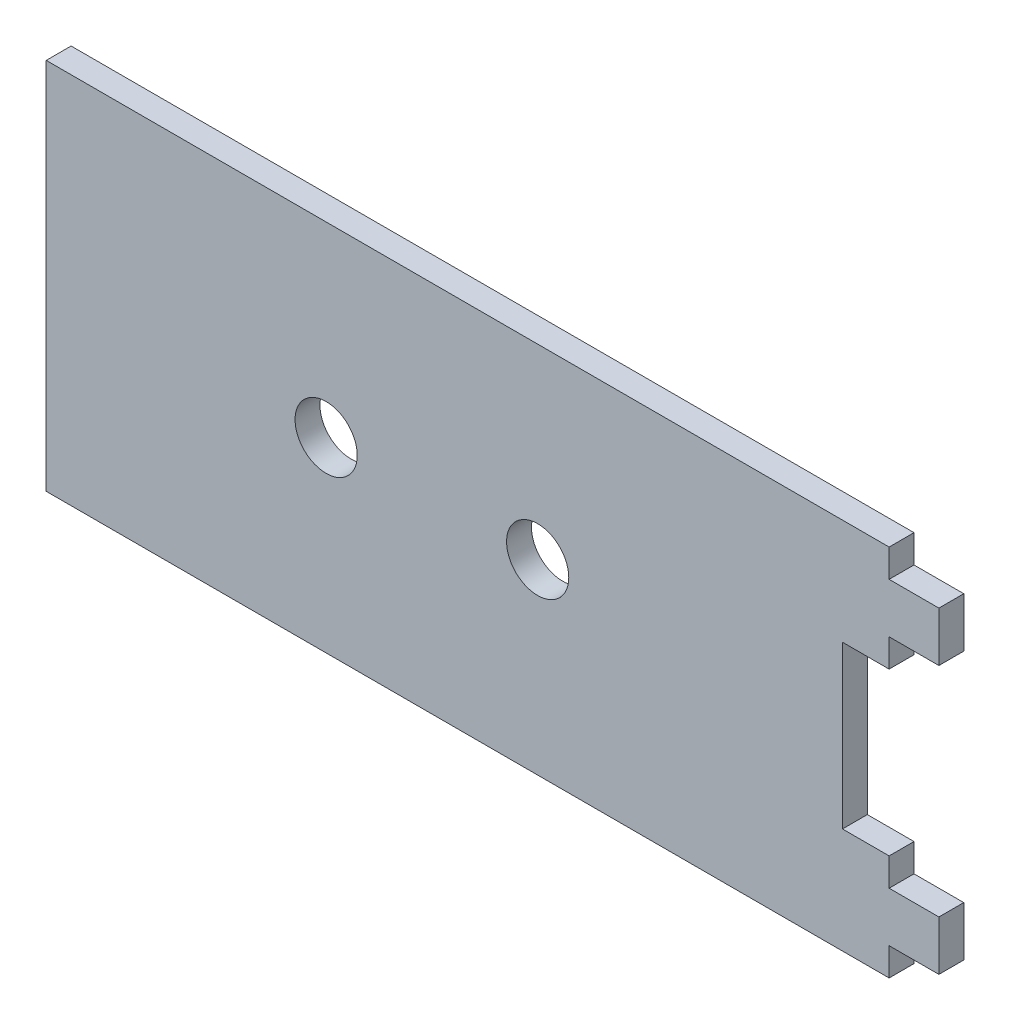
ISO-10303-21;
HEADER;
FILE_DESCRIPTION(('STEP AP214'),'2;1');
FILE_NAME('part.step','',(''),(''),'','','');
FILE_SCHEMA(('AUTOMOTIVE_DESIGN { 1 0 10303 214 1 1 1 1 }'));
ENDSEC;
DATA;
#1=APPLICATION_CONTEXT('core data for automotive mechanical design processes');
#2=APPLICATION_PROTOCOL_DEFINITION('international standard','automotive_design',2000,#1);
#3=PRODUCT_CONTEXT('',#1,'mechanical');
#4=PRODUCT('Part','Part','',(#3));
#5=PRODUCT_RELATED_PRODUCT_CATEGORY('part','',(#4));
#6=PRODUCT_DEFINITION_FORMATION('','',#4);
#7=PRODUCT_DEFINITION_CONTEXT('part definition',#1,'design');
#8=PRODUCT_DEFINITION('design','',#6,#7);
#9=PRODUCT_DEFINITION_SHAPE('','',#8);
#10=(LENGTH_UNIT() NAMED_UNIT(*) SI_UNIT(.MILLI.,.METRE.));
#11=(NAMED_UNIT(*) PLANE_ANGLE_UNIT() SI_UNIT($,.RADIAN.));
#12=(NAMED_UNIT(*) SI_UNIT($,.STERADIAN.) SOLID_ANGLE_UNIT());
#13=UNCERTAINTY_MEASURE_WITH_UNIT(LENGTH_MEASURE(1.E-05),#10,'distance_accuracy_value','');
#14=(GEOMETRIC_REPRESENTATION_CONTEXT(3) GLOBAL_UNCERTAINTY_ASSIGNED_CONTEXT((#13)) GLOBAL_UNIT_ASSIGNED_CONTEXT((#10,
#11,#12)) REPRESENTATION_CONTEXT('',''));
#15=CARTESIAN_POINT('',(0.,0.,0.));
#16=DIRECTION('',(0.,0.,1.));
#17=DIRECTION('',(1.,0.,0.));
#18=AXIS2_PLACEMENT_3D('',#15,#16,#17);
#19=CARTESIAN_POINT('',(0.,0.,4.));
#20=DIRECTION('',(0.,0.,-1.));
#21=DIRECTION('',(-1.,0.,0.));
#22=AXIS2_PLACEMENT_3D('',#19,#20,#21);
#23=PLANE('',#22);
#24=DIRECTION('',(-1.,0.,0.));
#25=VECTOR('',#24,1.);
#26=CARTESIAN_POINT('',(-79.,30.,4.));
#27=LINE('',#26,#25);
#28=CARTESIAN_POINT('',(56.5,30.,4.));
#29=VERTEX_POINT('',#28);
#30=CARTESIAN_POINT('',(-79.,30.,4.));
#31=VERTEX_POINT('',#30);
#32=EDGE_CURVE('E50',#29,#31,#27,.T.);
#33=ORIENTED_EDGE('',*,*,#32,.T.);
#34=DIRECTION('',(0.,-1.,0.));
#35=VECTOR('',#34,1.);
#36=CARTESIAN_POINT('',(-79.,-30.,4.));
#37=LINE('',#36,#35);
#38=CARTESIAN_POINT('',(-79.,-30.,4.));
#39=VERTEX_POINT('',#38);
#40=EDGE_CURVE('E118',#31,#39,#37,.T.);
#41=ORIENTED_EDGE('',*,*,#40,.T.);
#42=DIRECTION('',(1.,0.,0.));
#43=VECTOR('',#42,1.);
#44=CARTESIAN_POINT('',(-79.,-30.,4.));
#45=LINE('',#44,#43);
#46=CARTESIAN_POINT('',(56.5,-30.,4.));
#47=VERTEX_POINT('',#46);
#48=EDGE_CURVE('E250',#39,#47,#45,.T.);
#49=ORIENTED_EDGE('',*,*,#48,.T.);
#50=DIRECTION('',(0.,1.,0.));
#51=VECTOR('',#50,1.);
#52=CARTESIAN_POINT('',(56.5,-25.5,4.));
#53=LINE('',#52,#51);
#54=CARTESIAN_POINT('',(56.5,-25.5,4.));
#55=VERTEX_POINT('',#54);
#56=EDGE_CURVE('E270',#47,#55,#53,.T.);
#57=ORIENTED_EDGE('',*,*,#56,.T.);
#58=DIRECTION('',(1.,0.,0.));
#59=VECTOR('',#58,1.);
#60=CARTESIAN_POINT('',(64.5,-25.5,4.));
#61=LINE('',#60,#59);
#62=CARTESIAN_POINT('',(64.5,-25.5,4.));
#63=VERTEX_POINT('',#62);
#64=EDGE_CURVE('E267',#55,#63,#61,.T.);
#65=ORIENTED_EDGE('',*,*,#64,.T.);
#66=DIRECTION('',(0.,1.,0.));
#67=VECTOR('',#66,1.);
#68=CARTESIAN_POINT('',(64.5,-17.5,4.));
#69=LINE('',#68,#67);
#70=CARTESIAN_POINT('',(64.5,-17.5,4.));
#71=VERTEX_POINT('',#70);
#72=EDGE_CURVE('E269',#63,#71,#69,.T.);
#73=ORIENTED_EDGE('',*,*,#72,.T.);
#74=DIRECTION('',(-1.,0.,0.));
#75=VECTOR('',#74,1.);
#76=CARTESIAN_POINT('',(56.5,-17.5,4.));
#77=LINE('',#76,#75);
#78=CARTESIAN_POINT('',(56.5,-17.5,4.));
#79=VERTEX_POINT('',#78);
#80=EDGE_CURVE('E272',#71,#79,#77,.T.);
#81=ORIENTED_EDGE('',*,*,#80,.T.);
#82=DIRECTION('',(0.,1.,0.));
#83=VECTOR('',#82,1.);
#84=CARTESIAN_POINT('',(56.5,-13.,4.));
#85=LINE('',#84,#83);
#86=CARTESIAN_POINT('',(56.5,-13.,4.));
#87=VERTEX_POINT('',#86);
#88=EDGE_CURVE('E278',#79,#87,#85,.T.);
#89=ORIENTED_EDGE('',*,*,#88,.T.);
#90=DIRECTION('',(-1.,0.,0.));
#91=VECTOR('',#90,1.);
#92=CARTESIAN_POINT('',(49.,-13.,4.));
#93=LINE('',#92,#91);
#94=CARTESIAN_POINT('',(49.,-13.,4.));
#95=VERTEX_POINT('',#94);
#96=EDGE_CURVE('E280',#87,#95,#93,.T.);
#97=ORIENTED_EDGE('',*,*,#96,.T.);
#98=DIRECTION('',(0.,1.,0.));
#99=VECTOR('',#98,1.);
#100=CARTESIAN_POINT('',(49.,13.,4.));
#101=LINE('',#100,#99);
#102=CARTESIAN_POINT('',(49.,13.,4.));
#103=VERTEX_POINT('',#102);
#104=EDGE_CURVE('E282',#95,#103,#101,.T.);
#105=ORIENTED_EDGE('',*,*,#104,.T.);
#106=DIRECTION('',(1.,0.,0.));
#107=VECTOR('',#106,1.);
#108=CARTESIAN_POINT('',(56.5,13.,4.));
#109=LINE('',#108,#107);
#110=CARTESIAN_POINT('',(56.5,13.,4.));
#111=VERTEX_POINT('',#110);
#112=EDGE_CURVE('E284',#103,#111,#109,.T.);
#113=ORIENTED_EDGE('',*,*,#112,.T.);
#114=DIRECTION('',(0.,1.,0.));
#115=VECTOR('',#114,1.);
#116=CARTESIAN_POINT('',(56.5,17.5,4.));
#117=LINE('',#116,#115);
#118=CARTESIAN_POINT('',(56.5,17.5,4.));
#119=VERTEX_POINT('',#118);
#120=EDGE_CURVE('E286',#111,#119,#117,.T.);
#121=ORIENTED_EDGE('',*,*,#120,.T.);
#122=DIRECTION('',(1.,0.,0.));
#123=VECTOR('',#122,1.);
#124=CARTESIAN_POINT('',(64.5,17.5,4.));
#125=LINE('',#124,#123);
#126=CARTESIAN_POINT('',(64.5,17.5,4.));
#127=VERTEX_POINT('',#126);
#128=EDGE_CURVE('E162',#119,#127,#125,.T.);
#129=ORIENTED_EDGE('',*,*,#128,.T.);
#130=DIRECTION('',(0.,1.,0.));
#131=VECTOR('',#130,1.);
#132=CARTESIAN_POINT('',(64.5,25.5,4.));
#133=LINE('',#132,#131);
#134=CARTESIAN_POINT('',(64.5,25.5,4.));
#135=VERTEX_POINT('',#134);
#136=EDGE_CURVE('E156',#127,#135,#133,.T.);
#137=ORIENTED_EDGE('',*,*,#136,.T.);
#138=DIRECTION('',(-1.,0.,0.));
#139=VECTOR('',#138,1.);
#140=CARTESIAN_POINT('',(56.5,25.5,4.));
#141=LINE('',#140,#139);
#142=CARTESIAN_POINT('',(56.5,25.5,4.));
#143=VERTEX_POINT('',#142);
#144=EDGE_CURVE('E160',#135,#143,#141,.T.);
#145=ORIENTED_EDGE('',*,*,#144,.T.);
#146=DIRECTION('',(0.,1.,0.));
#147=VECTOR('',#146,1.);
#148=CARTESIAN_POINT('',(56.5,30.,4.));
#149=LINE('',#148,#147);
#150=EDGE_CURVE('E176',#143,#29,#149,.T.);
#151=ORIENTED_EDGE('',*,*,#150,.T.);
#152=EDGE_LOOP('',(#33,#41,#49,#57,#65,#73,#81,#89,#97,#105,#113,#121,#129,#137,#145,#151));
#153=FACE_BOUND('',#152,.T.);
#154=CARTESIAN_POINT('',(0.,0.,4.));
#155=DIRECTION('',(0.,0.,1.));
#156=DIRECTION('',(1.,0.,0.));
#157=AXIS2_PLACEMENT_3D('',#154,#155,#156);
#158=CIRCLE('',#157,5.);
#159=CARTESIAN_POINT('',(5.,0.,4.));
#160=VERTEX_POINT('',#159);
#161=EDGE_CURVE('E186',#160,#160,#158,.T.);
#162=ORIENTED_EDGE('',*,*,#161,.F.);
#163=EDGE_LOOP('',(#162));
#164=FACE_BOUND('',#163,.T.);
#165=CARTESIAN_POINT('',(-34.,0.,4.));
#166=DIRECTION('',(0.,0.,1.));
#167=DIRECTION('',(1.,0.,0.));
#168=AXIS2_PLACEMENT_3D('',#165,#166,#167);
#169=CIRCLE('',#168,5.);
#170=CARTESIAN_POINT('',(-29.,0.,4.));
#171=VERTEX_POINT('',#170);
#172=EDGE_CURVE('E497',#171,#171,#169,.T.);
#173=ORIENTED_EDGE('',*,*,#172,.F.);
#174=EDGE_LOOP('',(#173));
#175=FACE_BOUND('',#174,.T.);
#176=ADVANCED_FACE('F33',(#153,#164,#175),#23,.F.);
#177=CARTESIAN_POINT('',(0.,0.,0.));
#178=DIRECTION('',(0.,0.,-1.));
#179=DIRECTION('',(-1.,0.,0.));
#180=AXIS2_PLACEMENT_3D('',#177,#178,#179);
#181=PLANE('',#180);
#182=CARTESIAN_POINT('',(0.,0.,0.));
#183=DIRECTION('',(0.,0.,1.));
#184=DIRECTION('',(1.,0.,0.));
#185=AXIS2_PLACEMENT_3D('',#182,#183,#184);
#186=CIRCLE('',#185,5.);
#187=CARTESIAN_POINT('',(5.,0.,0.));
#188=VERTEX_POINT('',#187);
#189=EDGE_CURVE('E502',#188,#188,#186,.T.);
#190=ORIENTED_EDGE('',*,*,#189,.T.);
#191=EDGE_LOOP('',(#190));
#192=FACE_BOUND('',#191,.T.);
#193=DIRECTION('',(0.,-1.,0.));
#194=VECTOR('',#193,1.);
#195=CARTESIAN_POINT('',(-79.,-30.,0.));
#196=LINE('',#195,#194);
#197=CARTESIAN_POINT('',(-79.,30.,0.));
#198=VERTEX_POINT('',#197);
#199=CARTESIAN_POINT('',(-79.,-30.,0.));
#200=VERTEX_POINT('',#199);
#201=EDGE_CURVE('E182',#198,#200,#196,.T.);
#202=ORIENTED_EDGE('',*,*,#201,.F.);
#203=DIRECTION('',(-1.,0.,0.));
#204=VECTOR('',#203,1.);
#205=CARTESIAN_POINT('',(49.,30.,0.));
#206=LINE('',#205,#204);
#207=CARTESIAN_POINT('',(56.5,30.,0.));
#208=VERTEX_POINT('',#207);
#209=EDGE_CURVE('E211',#208,#198,#206,.T.);
#210=ORIENTED_EDGE('',*,*,#209,.F.);
#211=DIRECTION('',(0.,1.,0.));
#212=VECTOR('',#211,1.);
#213=CARTESIAN_POINT('',(56.5,30.,0.));
#214=LINE('',#213,#212);
#215=CARTESIAN_POINT('',(56.5,25.5,0.));
#216=VERTEX_POINT('',#215);
#217=EDGE_CURVE('E111',#216,#208,#214,.T.);
#218=ORIENTED_EDGE('',*,*,#217,.F.);
#219=DIRECTION('',(-1.,0.,0.));
#220=VECTOR('',#219,1.);
#221=CARTESIAN_POINT('',(56.5,25.5,0.));
#222=LINE('',#221,#220);
#223=CARTESIAN_POINT('',(64.5,25.5,0.));
#224=VERTEX_POINT('',#223);
#225=EDGE_CURVE('E104',#224,#216,#222,.T.);
#226=ORIENTED_EDGE('',*,*,#225,.F.);
#227=DIRECTION('',(0.,1.,0.));
#228=VECTOR('',#227,1.);
#229=CARTESIAN_POINT('',(64.5,25.5,0.));
#230=LINE('',#229,#228);
#231=CARTESIAN_POINT('',(64.5,17.5,0.));
#232=VERTEX_POINT('',#231);
#233=EDGE_CURVE('E170',#232,#224,#230,.T.);
#234=ORIENTED_EDGE('',*,*,#233,.F.);
#235=DIRECTION('',(1.,0.,0.));
#236=VECTOR('',#235,1.);
#237=CARTESIAN_POINT('',(64.5,17.5,0.));
#238=LINE('',#237,#236);
#239=CARTESIAN_POINT('',(56.5,17.5,0.));
#240=VERTEX_POINT('',#239);
#241=EDGE_CURVE('E206',#240,#232,#238,.T.);
#242=ORIENTED_EDGE('',*,*,#241,.F.);
#243=DIRECTION('',(0.,1.,0.));
#244=VECTOR('',#243,1.);
#245=CARTESIAN_POINT('',(56.5,17.5,0.));
#246=LINE('',#245,#244);
#247=CARTESIAN_POINT('',(56.5,13.,0.));
#248=VERTEX_POINT('',#247);
#249=EDGE_CURVE('E204',#248,#240,#246,.T.);
#250=ORIENTED_EDGE('',*,*,#249,.F.);
#251=DIRECTION('',(1.,0.,0.));
#252=VECTOR('',#251,1.);
#253=CARTESIAN_POINT('',(56.5,13.,0.));
#254=LINE('',#253,#252);
#255=CARTESIAN_POINT('',(49.,13.,0.));
#256=VERTEX_POINT('',#255);
#257=EDGE_CURVE('E202',#256,#248,#254,.T.);
#258=ORIENTED_EDGE('',*,*,#257,.F.);
#259=DIRECTION('',(0.,1.,0.));
#260=VECTOR('',#259,1.);
#261=CARTESIAN_POINT('',(49.,13.,0.));
#262=LINE('',#261,#260);
#263=CARTESIAN_POINT('',(49.,-13.,0.));
#264=VERTEX_POINT('',#263);
#265=EDGE_CURVE('E200',#264,#256,#262,.T.);
#266=ORIENTED_EDGE('',*,*,#265,.F.);
#267=DIRECTION('',(-1.,0.,0.));
#268=VECTOR('',#267,1.);
#269=CARTESIAN_POINT('',(49.,-13.,0.));
#270=LINE('',#269,#268);
#271=CARTESIAN_POINT('',(56.5,-13.,0.));
#272=VERTEX_POINT('',#271);
#273=EDGE_CURVE('E198',#272,#264,#270,.T.);
#274=ORIENTED_EDGE('',*,*,#273,.F.);
#275=DIRECTION('',(0.,1.,0.));
#276=VECTOR('',#275,1.);
#277=CARTESIAN_POINT('',(56.5,-13.,0.));
#278=LINE('',#277,#276);
#279=CARTESIAN_POINT('',(56.5,-17.5,0.));
#280=VERTEX_POINT('',#279);
#281=EDGE_CURVE('E196',#280,#272,#278,.T.);
#282=ORIENTED_EDGE('',*,*,#281,.F.);
#283=DIRECTION('',(-1.,0.,0.));
#284=VECTOR('',#283,1.);
#285=CARTESIAN_POINT('',(56.5,-17.5,0.));
#286=LINE('',#285,#284);
#287=CARTESIAN_POINT('',(64.5,-17.5,0.));
#288=VERTEX_POINT('',#287);
#289=EDGE_CURVE('E194',#288,#280,#286,.T.);
#290=ORIENTED_EDGE('',*,*,#289,.F.);
#291=DIRECTION('',(0.,1.,0.));
#292=VECTOR('',#291,1.);
#293=CARTESIAN_POINT('',(64.5,-17.5,0.));
#294=LINE('',#293,#292);
#295=CARTESIAN_POINT('',(64.5,-25.5,0.));
#296=VERTEX_POINT('',#295);
#297=EDGE_CURVE('E192',#296,#288,#294,.T.);
#298=ORIENTED_EDGE('',*,*,#297,.F.);
#299=DIRECTION('',(1.,0.,0.));
#300=VECTOR('',#299,1.);
#301=CARTESIAN_POINT('',(64.5,-25.5,0.));
#302=LINE('',#301,#300);
#303=CARTESIAN_POINT('',(56.5,-25.5,0.));
#304=VERTEX_POINT('',#303);
#305=EDGE_CURVE('E190',#304,#296,#302,.T.);
#306=ORIENTED_EDGE('',*,*,#305,.F.);
#307=DIRECTION('',(0.,1.,0.));
#308=VECTOR('',#307,1.);
#309=CARTESIAN_POINT('',(56.5,-25.5,0.));
#310=LINE('',#309,#308);
#311=CARTESIAN_POINT('',(56.5,-30.,0.));
#312=VERTEX_POINT('',#311);
#313=EDGE_CURVE('E188',#312,#304,#310,.T.);
#314=ORIENTED_EDGE('',*,*,#313,.F.);
#315=DIRECTION('',(1.,0.,0.));
#316=VECTOR('',#315,1.);
#317=CARTESIAN_POINT('',(56.5,-30.,0.));
#318=LINE('',#317,#316);
#319=EDGE_CURVE('E185',#200,#312,#318,.T.);
#320=ORIENTED_EDGE('',*,*,#319,.F.);
#321=EDGE_LOOP('',(#202,#210,#218,#226,#234,#242,#250,#258,#266,#274,#282,#290,#298,#306,#314,#320));
#322=FACE_BOUND('',#321,.T.);
#323=CARTESIAN_POINT('',(-34.,0.,0.));
#324=DIRECTION('',(0.,0.,1.));
#325=DIRECTION('',(1.,0.,0.));
#326=AXIS2_PLACEMENT_3D('',#323,#324,#325);
#327=CIRCLE('',#326,5.);
#328=CARTESIAN_POINT('',(-29.,0.,0.));
#329=VERTEX_POINT('',#328);
#330=EDGE_CURVE('E500',#329,#329,#327,.T.);
#331=ORIENTED_EDGE('',*,*,#330,.T.);
#332=EDGE_LOOP('',(#331));
#333=FACE_BOUND('',#332,.T.);
#334=ADVANCED_FACE('F254',(#192,#322,#333),#181,.T.);
#335=CARTESIAN_POINT('',(-79.,-30.,4.));
#336=DIRECTION('',(1.,0.,0.));
#337=DIRECTION('',(0.,0.,-1.));
#338=AXIS2_PLACEMENT_3D('',#335,#336,#337);
#339=PLANE('',#338);
#340=ORIENTED_EDGE('',*,*,#201,.T.);
#341=DIRECTION('',(0.,0.,-1.));
#342=VECTOR('',#341,1.);
#343=CARTESIAN_POINT('',(-79.,-30.,4.));
#344=LINE('',#343,#342);
#345=EDGE_CURVE('E42',#39,#200,#344,.T.);
#346=ORIENTED_EDGE('',*,*,#345,.F.);
#347=ORIENTED_EDGE('',*,*,#40,.F.);
#348=DIRECTION('',(0.,0.,-1.));
#349=VECTOR('',#348,1.);
#350=CARTESIAN_POINT('',(-79.,30.,4.));
#351=LINE('',#350,#349);
#352=EDGE_CURVE('E11',#31,#198,#351,.T.);
#353=ORIENTED_EDGE('',*,*,#352,.T.);
#354=EDGE_LOOP('',(#340,#346,#347,#353));
#355=FACE_BOUND('',#354,.T.);
#356=ADVANCED_FACE('F35',(#355),#339,.F.);
#357=CARTESIAN_POINT('',(56.5,-30.,4.));
#358=DIRECTION('',(0.,1.,0.));
#359=DIRECTION('',(0.,0.,1.));
#360=AXIS2_PLACEMENT_3D('',#357,#358,#359);
#361=PLANE('',#360);
#362=ORIENTED_EDGE('',*,*,#319,.T.);
#363=DIRECTION('',(0.,0.,-1.));
#364=VECTOR('',#363,1.);
#365=CARTESIAN_POINT('',(56.5,-30.,4.));
#366=LINE('',#365,#364);
#367=EDGE_CURVE('E243',#47,#312,#366,.T.);
#368=ORIENTED_EDGE('',*,*,#367,.F.);
#369=ORIENTED_EDGE('',*,*,#48,.F.);
#370=ORIENTED_EDGE('',*,*,#345,.T.);
#371=EDGE_LOOP('',(#362,#368,#369,#370));
#372=FACE_BOUND('',#371,.T.);
#373=ADVANCED_FACE('F248',(#372),#361,.F.);
#374=CARTESIAN_POINT('',(56.5,-25.5,4.));
#375=DIRECTION('',(-1.,0.,0.));
#376=DIRECTION('',(0.,0.,1.));
#377=AXIS2_PLACEMENT_3D('',#374,#375,#376);
#378=PLANE('',#377);
#379=ORIENTED_EDGE('',*,*,#313,.T.);
#380=DIRECTION('',(0.,0.,-1.));
#381=VECTOR('',#380,1.);
#382=CARTESIAN_POINT('',(56.5,-25.5,4.));
#383=LINE('',#382,#381);
#384=EDGE_CURVE('E240',#55,#304,#383,.T.);
#385=ORIENTED_EDGE('',*,*,#384,.F.);
#386=ORIENTED_EDGE('',*,*,#56,.F.);
#387=ORIENTED_EDGE('',*,*,#367,.T.);
#388=EDGE_LOOP('',(#379,#385,#386,#387));
#389=FACE_BOUND('',#388,.T.);
#390=ADVANCED_FACE('F261',(#389),#378,.F.);
#391=CARTESIAN_POINT('',(64.5,-25.5,4.));
#392=DIRECTION('',(0.,1.,0.));
#393=DIRECTION('',(0.,0.,1.));
#394=AXIS2_PLACEMENT_3D('',#391,#392,#393);
#395=PLANE('',#394);
#396=ORIENTED_EDGE('',*,*,#305,.T.);
#397=DIRECTION('',(0.,0.,-1.));
#398=VECTOR('',#397,1.);
#399=CARTESIAN_POINT('',(64.5,-25.5,4.));
#400=LINE('',#399,#398);
#401=EDGE_CURVE('E237',#63,#296,#400,.T.);
#402=ORIENTED_EDGE('',*,*,#401,.F.);
#403=ORIENTED_EDGE('',*,*,#64,.F.);
#404=ORIENTED_EDGE('',*,*,#384,.T.);
#405=EDGE_LOOP('',(#396,#402,#403,#404));
#406=FACE_BOUND('',#405,.T.);
#407=ADVANCED_FACE('F265',(#406),#395,.F.);
#408=CARTESIAN_POINT('',(64.5,-17.5,4.));
#409=DIRECTION('',(-1.,0.,0.));
#410=DIRECTION('',(0.,0.,1.));
#411=AXIS2_PLACEMENT_3D('',#408,#409,#410);
#412=PLANE('',#411);
#413=ORIENTED_EDGE('',*,*,#297,.T.);
#414=DIRECTION('',(0.,0.,-1.));
#415=VECTOR('',#414,1.);
#416=CARTESIAN_POINT('',(64.5,-17.5,4.));
#417=LINE('',#416,#415);
#418=EDGE_CURVE('E234',#71,#288,#417,.T.);
#419=ORIENTED_EDGE('',*,*,#418,.F.);
#420=ORIENTED_EDGE('',*,*,#72,.F.);
#421=ORIENTED_EDGE('',*,*,#401,.T.);
#422=EDGE_LOOP('',(#413,#419,#420,#421));
#423=FACE_BOUND('',#422,.T.);
#424=ADVANCED_FACE('F322',(#423),#412,.F.);
#425=CARTESIAN_POINT('',(56.5,-17.5,4.));
#426=DIRECTION('',(0.,-1.,0.));
#427=DIRECTION('',(0.,0.,-1.));
#428=AXIS2_PLACEMENT_3D('',#425,#426,#427);
#429=PLANE('',#428);
#430=ORIENTED_EDGE('',*,*,#289,.T.);
#431=DIRECTION('',(0.,0.,-1.));
#432=VECTOR('',#431,1.);
#433=CARTESIAN_POINT('',(56.5,-17.5,4.));
#434=LINE('',#433,#432);
#435=EDGE_CURVE('E231',#79,#280,#434,.T.);
#436=ORIENTED_EDGE('',*,*,#435,.F.);
#437=ORIENTED_EDGE('',*,*,#80,.F.);
#438=ORIENTED_EDGE('',*,*,#418,.T.);
#439=EDGE_LOOP('',(#430,#436,#437,#438));
#440=FACE_BOUND('',#439,.T.);
#441=ADVANCED_FACE('F319',(#440),#429,.F.);
#442=CARTESIAN_POINT('',(56.5,-13.,4.));
#443=DIRECTION('',(-1.,0.,0.));
#444=DIRECTION('',(0.,0.,1.));
#445=AXIS2_PLACEMENT_3D('',#442,#443,#444);
#446=PLANE('',#445);
#447=ORIENTED_EDGE('',*,*,#281,.T.);
#448=DIRECTION('',(0.,0.,-1.));
#449=VECTOR('',#448,1.);
#450=CARTESIAN_POINT('',(56.5,-13.,4.));
#451=LINE('',#450,#449);
#452=EDGE_CURVE('E228',#87,#272,#451,.T.);
#453=ORIENTED_EDGE('',*,*,#452,.F.);
#454=ORIENTED_EDGE('',*,*,#88,.F.);
#455=ORIENTED_EDGE('',*,*,#435,.T.);
#456=EDGE_LOOP('',(#447,#453,#454,#455));
#457=FACE_BOUND('',#456,.T.);
#458=ADVANCED_FACE('F314',(#457),#446,.F.);
#459=CARTESIAN_POINT('',(49.,-13.,4.));
#460=DIRECTION('',(0.,-1.,0.));
#461=DIRECTION('',(0.,0.,-1.));
#462=AXIS2_PLACEMENT_3D('',#459,#460,#461);
#463=PLANE('',#462);
#464=ORIENTED_EDGE('',*,*,#273,.T.);
#465=DIRECTION('',(0.,0.,-1.));
#466=VECTOR('',#465,1.);
#467=CARTESIAN_POINT('',(49.,-13.,4.));
#468=LINE('',#467,#466);
#469=EDGE_CURVE('E225',#95,#264,#468,.T.);
#470=ORIENTED_EDGE('',*,*,#469,.F.);
#471=ORIENTED_EDGE('',*,*,#96,.F.);
#472=ORIENTED_EDGE('',*,*,#452,.T.);
#473=EDGE_LOOP('',(#464,#470,#471,#472));
#474=FACE_BOUND('',#473,.T.);
#475=ADVANCED_FACE('F309',(#474),#463,.F.);
#476=CARTESIAN_POINT('',(49.,13.,4.));
#477=DIRECTION('',(-1.,0.,0.));
#478=DIRECTION('',(0.,0.,1.));
#479=AXIS2_PLACEMENT_3D('',#476,#477,#478);
#480=PLANE('',#479);
#481=ORIENTED_EDGE('',*,*,#265,.T.);
#482=DIRECTION('',(0.,0.,-1.));
#483=VECTOR('',#482,1.);
#484=CARTESIAN_POINT('',(49.,13.,4.));
#485=LINE('',#484,#483);
#486=EDGE_CURVE('E222',#103,#256,#485,.T.);
#487=ORIENTED_EDGE('',*,*,#486,.F.);
#488=ORIENTED_EDGE('',*,*,#104,.F.);
#489=ORIENTED_EDGE('',*,*,#469,.T.);
#490=EDGE_LOOP('',(#481,#487,#488,#489));
#491=FACE_BOUND('',#490,.T.);
#492=ADVANCED_FACE('F305',(#491),#480,.F.);
#493=CARTESIAN_POINT('',(56.5,13.,4.));
#494=DIRECTION('',(0.,1.,0.));
#495=DIRECTION('',(-1.,0.,0.));
#496=AXIS2_PLACEMENT_3D('',#493,#494,#495);
#497=PLANE('',#496);
#498=ORIENTED_EDGE('',*,*,#257,.T.);
#499=DIRECTION('',(0.,0.,-1.));
#500=VECTOR('',#499,1.);
#501=CARTESIAN_POINT('',(56.5,13.,4.));
#502=LINE('',#501,#500);
#503=EDGE_CURVE('E219',#111,#248,#502,.T.);
#504=ORIENTED_EDGE('',*,*,#503,.F.);
#505=ORIENTED_EDGE('',*,*,#112,.F.);
#506=ORIENTED_EDGE('',*,*,#486,.T.);
#507=EDGE_LOOP('',(#498,#504,#505,#506));
#508=FACE_BOUND('',#507,.T.);
#509=ADVANCED_FACE('F301',(#508),#497,.F.);
#510=CARTESIAN_POINT('',(56.5,17.5,4.));
#511=DIRECTION('',(-1.,0.,0.));
#512=DIRECTION('',(0.,0.,1.));
#513=AXIS2_PLACEMENT_3D('',#510,#511,#512);
#514=PLANE('',#513);
#515=ORIENTED_EDGE('',*,*,#249,.T.);
#516=DIRECTION('',(0.,0.,-1.));
#517=VECTOR('',#516,1.);
#518=CARTESIAN_POINT('',(56.5,17.5,4.));
#519=LINE('',#518,#517);
#520=EDGE_CURVE('E216',#119,#240,#519,.T.);
#521=ORIENTED_EDGE('',*,*,#520,.F.);
#522=ORIENTED_EDGE('',*,*,#120,.F.);
#523=ORIENTED_EDGE('',*,*,#503,.T.);
#524=EDGE_LOOP('',(#515,#521,#522,#523));
#525=FACE_BOUND('',#524,.T.);
#526=ADVANCED_FACE('F292',(#525),#514,.F.);
#527=CARTESIAN_POINT('',(64.5,17.5,4.));
#528=DIRECTION('',(0.,1.,0.));
#529=DIRECTION('',(0.,0.,1.));
#530=AXIS2_PLACEMENT_3D('',#527,#528,#529);
#531=PLANE('',#530);
#532=ORIENTED_EDGE('',*,*,#241,.T.);
#533=DIRECTION('',(0.,0.,-1.));
#534=VECTOR('',#533,1.);
#535=CARTESIAN_POINT('',(64.5,17.5,4.));
#536=LINE('',#535,#534);
#537=EDGE_CURVE('E171',#127,#232,#536,.T.);
#538=ORIENTED_EDGE('',*,*,#537,.F.);
#539=ORIENTED_EDGE('',*,*,#128,.F.);
#540=ORIENTED_EDGE('',*,*,#520,.T.);
#541=EDGE_LOOP('',(#532,#538,#539,#540));
#542=FACE_BOUND('',#541,.T.);
#543=ADVANCED_FACE('F296',(#542),#531,.F.);
#544=CARTESIAN_POINT('',(64.5,25.5,4.));
#545=DIRECTION('',(-1.,0.,0.));
#546=DIRECTION('',(0.,0.,1.));
#547=AXIS2_PLACEMENT_3D('',#544,#545,#546);
#548=PLANE('',#547);
#549=ORIENTED_EDGE('',*,*,#233,.T.);
#550=DIRECTION('',(0.,0.,-1.));
#551=VECTOR('',#550,1.);
#552=CARTESIAN_POINT('',(64.5,25.5,4.));
#553=LINE('',#552,#551);
#554=EDGE_CURVE('E167',#135,#224,#553,.T.);
#555=ORIENTED_EDGE('',*,*,#554,.F.);
#556=ORIENTED_EDGE('',*,*,#136,.F.);
#557=ORIENTED_EDGE('',*,*,#537,.T.);
#558=EDGE_LOOP('',(#549,#555,#556,#557));
#559=FACE_BOUND('',#558,.T.);
#560=ADVANCED_FACE('F168',(#559),#548,.F.);
#561=CARTESIAN_POINT('',(56.5,25.5,4.));
#562=DIRECTION('',(0.,-1.,0.));
#563=DIRECTION('',(0.,0.,-1.));
#564=AXIS2_PLACEMENT_3D('',#561,#562,#563);
#565=PLANE('',#564);
#566=ORIENTED_EDGE('',*,*,#225,.T.);
#567=DIRECTION('',(0.,0.,-1.));
#568=VECTOR('',#567,1.);
#569=CARTESIAN_POINT('',(56.5,25.5,4.));
#570=LINE('',#569,#568);
#571=EDGE_CURVE('E172',#143,#216,#570,.T.);
#572=ORIENTED_EDGE('',*,*,#571,.F.);
#573=ORIENTED_EDGE('',*,*,#144,.F.);
#574=ORIENTED_EDGE('',*,*,#554,.T.);
#575=EDGE_LOOP('',(#566,#572,#573,#574));
#576=FACE_BOUND('',#575,.T.);
#577=ADVANCED_FACE('F174',(#576),#565,.F.);
#578=CARTESIAN_POINT('',(56.5,30.,4.));
#579=DIRECTION('',(-1.,0.,0.));
#580=DIRECTION('',(0.,0.,1.));
#581=AXIS2_PLACEMENT_3D('',#578,#579,#580);
#582=PLANE('',#581);
#583=ORIENTED_EDGE('',*,*,#217,.T.);
#584=DIRECTION('',(0.,0.,-1.));
#585=VECTOR('',#584,1.);
#586=CARTESIAN_POINT('',(56.5,30.,4.));
#587=LINE('',#586,#585);
#588=EDGE_CURVE('E178',#29,#208,#587,.T.);
#589=ORIENTED_EDGE('',*,*,#588,.F.);
#590=ORIENTED_EDGE('',*,*,#150,.F.);
#591=ORIENTED_EDGE('',*,*,#571,.T.);
#592=EDGE_LOOP('',(#583,#589,#590,#591));
#593=FACE_BOUND('',#592,.T.);
#594=ADVANCED_FACE('F345',(#593),#582,.F.);
#595=CARTESIAN_POINT('',(49.,30.,4.));
#596=DIRECTION('',(0.,-1.,0.));
#597=DIRECTION('',(0.,0.,-1.));
#598=AXIS2_PLACEMENT_3D('',#595,#596,#597);
#599=PLANE('',#598);
#600=ORIENTED_EDGE('',*,*,#209,.T.);
#601=ORIENTED_EDGE('',*,*,#352,.F.);
#602=ORIENTED_EDGE('',*,*,#32,.F.);
#603=ORIENTED_EDGE('',*,*,#588,.T.);
#604=EDGE_LOOP('',(#600,#601,#602,#603));
#605=FACE_BOUND('',#604,.T.);
#606=ADVANCED_FACE('F342',(#605),#599,.F.);
#607=CARTESIAN_POINT('',(0.,0.,4.));
#608=DIRECTION('',(0.,0.,-1.));
#609=DIRECTION('',(-1.,0.,0.));
#610=AXIS2_PLACEMENT_3D('',#607,#608,#609);
#611=CYLINDRICAL_SURFACE('',#610,5.);
#612=ORIENTED_EDGE('',*,*,#161,.T.);
#613=EDGE_LOOP('',(#612));
#614=FACE_BOUND('',#613,.T.);
#615=ORIENTED_EDGE('',*,*,#189,.F.);
#616=EDGE_LOOP('',(#615));
#617=FACE_BOUND('',#616,.T.);
#618=ADVANCED_FACE('F339',(#614,#617),#611,.F.);
#619=CARTESIAN_POINT('',(-34.,0.,4.));
#620=DIRECTION('',(0.,0.,-1.));
#621=DIRECTION('',(-1.,0.,0.));
#622=AXIS2_PLACEMENT_3D('',#619,#620,#621);
#623=CYLINDRICAL_SURFACE('',#622,5.);
#624=ORIENTED_EDGE('',*,*,#172,.T.);
#625=EDGE_LOOP('',(#624));
#626=FACE_BOUND('',#625,.T.);
#627=ORIENTED_EDGE('',*,*,#330,.F.);
#628=EDGE_LOOP('',(#627));
#629=FACE_BOUND('',#628,.T.);
#630=ADVANCED_FACE('F409',(#626,#629),#623,.F.);
#631=CLOSED_SHELL('',(#176,#334,#356,#373,#390,#407,#424,#441,#458,#475,#492,#509,#526,#543,
#560,#577,#594,#606,#618,#630));
#632=MANIFOLD_SOLID_BREP('B2',#631);
#633=ADVANCED_BREP_SHAPE_REPRESENTATION('',(#18,#632),#14);
#634=SHAPE_DEFINITION_REPRESENTATION(#9,#633);
ENDSEC;
END-ISO-10303-21;
